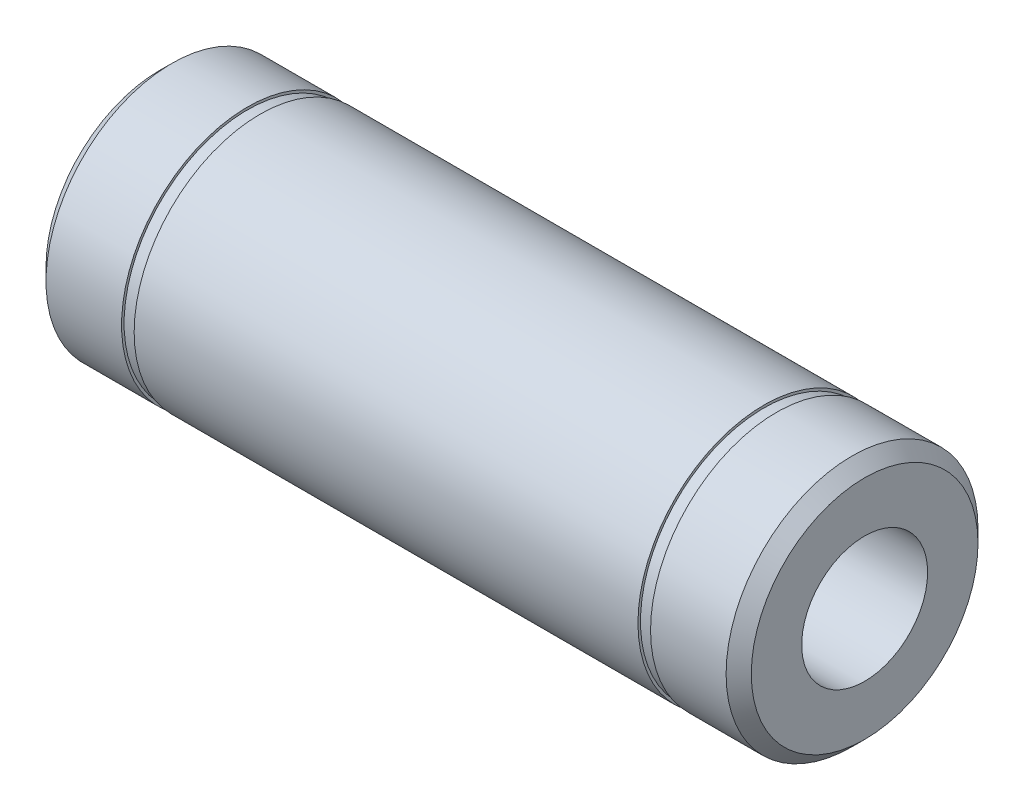
ISO-10303-21;
HEADER;
FILE_DESCRIPTION(('STEP AP214'),'2;1');
FILE_NAME('part.step','',(''),(''),'','','');
FILE_SCHEMA(('AUTOMOTIVE_DESIGN { 1 0 10303 214 1 1 1 1 }'));
ENDSEC;
DATA;
#1=APPLICATION_CONTEXT('core data for automotive mechanical design processes');
#2=APPLICATION_PROTOCOL_DEFINITION('international standard','automotive_design',2000,#1);
#3=PRODUCT_CONTEXT('',#1,'mechanical');
#4=PRODUCT('Part','Part','',(#3));
#5=PRODUCT_RELATED_PRODUCT_CATEGORY('part','',(#4));
#6=PRODUCT_DEFINITION_FORMATION('','',#4);
#7=PRODUCT_DEFINITION_CONTEXT('part definition',#1,'design');
#8=PRODUCT_DEFINITION('design','',#6,#7);
#9=PRODUCT_DEFINITION_SHAPE('','',#8);
#10=(LENGTH_UNIT() NAMED_UNIT(*) SI_UNIT(.MILLI.,.METRE.));
#11=(NAMED_UNIT(*) PLANE_ANGLE_UNIT() SI_UNIT($,.RADIAN.));
#12=(NAMED_UNIT(*) SI_UNIT($,.STERADIAN.) SOLID_ANGLE_UNIT());
#13=UNCERTAINTY_MEASURE_WITH_UNIT(LENGTH_MEASURE(1.E-05),#10,'distance_accuracy_value','');
#14=(GEOMETRIC_REPRESENTATION_CONTEXT(3) GLOBAL_UNCERTAINTY_ASSIGNED_CONTEXT((#13)) GLOBAL_UNIT_ASSIGNED_CONTEXT((#10,
#11,#12)) REPRESENTATION_CONTEXT('',''));
#15=CARTESIAN_POINT('',(0.,0.,0.));
#16=DIRECTION('',(0.,0.,1.));
#17=DIRECTION('',(1.,0.,0.));
#18=AXIS2_PLACEMENT_3D('',#15,#16,#17);
#19=CARTESIAN_POINT('',(14.,0.,0.));
#20=DIRECTION('',(-1.,0.,0.));
#21=DIRECTION('',(0.,0.,1.));
#22=AXIS2_PLACEMENT_3D('',#19,#20,#21);
#23=CYLINDRICAL_SURFACE('',#22,5.);
#24=CARTESIAN_POINT('',(13.5,0.,0.));
#25=DIRECTION('',(1.,0.,0.));
#26=DIRECTION('',(0.,0.,-1.));
#27=AXIS2_PLACEMENT_3D('',#24,#25,#26);
#28=CIRCLE('',#27,5.);
#29=CARTESIAN_POINT('',(13.5,0.,-5.));
#30=VERTEX_POINT('',#29);
#31=EDGE_CURVE('E48',#30,#30,#28,.F.);
#32=ORIENTED_EDGE('',*,*,#31,.T.);
#33=EDGE_LOOP('',(#32));
#34=FACE_BOUND('',#33,.T.);
#35=CARTESIAN_POINT('',(10.5,0.,0.));
#36=DIRECTION('',(-1.,0.,0.));
#37=DIRECTION('',(0.,0.,1.));
#38=AXIS2_PLACEMENT_3D('',#35,#36,#37);
#39=CIRCLE('',#38,5.);
#40=CARTESIAN_POINT('',(10.5,0.,5.));
#41=VERTEX_POINT('',#40);
#42=EDGE_CURVE('E44',#41,#41,#39,.T.);
#43=ORIENTED_EDGE('',*,*,#42,.F.);
#44=EDGE_LOOP('',(#43));
#45=FACE_BOUND('',#44,.T.);
#46=ADVANCED_FACE('F39',(#34,#45),#23,.T.);
#47=CARTESIAN_POINT('',(-13.5,0.,0.));
#48=DIRECTION('',(1.,0.,0.));
#49=DIRECTION('',(0.,0.,-1.));
#50=AXIS2_PLACEMENT_3D('',#47,#48,#49);
#51=CIRCLE('',#50,5.);
#52=CARTESIAN_POINT('',(-13.5,0.,-5.));
#53=VERTEX_POINT('',#52);
#54=EDGE_CURVE('E53',#53,#53,#51,.T.);
#55=ORIENTED_EDGE('',*,*,#54,.T.);
#56=EDGE_LOOP('',(#55));
#57=FACE_BOUND('',#56,.T.);
#58=CARTESIAN_POINT('',(-10.5,0.,0.));
#59=DIRECTION('',(1.,0.,0.));
#60=DIRECTION('',(0.,0.,-1.));
#61=AXIS2_PLACEMENT_3D('',#58,#59,#60);
#62=CIRCLE('',#61,5.);
#63=CARTESIAN_POINT('',(-10.5,0.,-5.));
#64=VERTEX_POINT('',#63);
#65=EDGE_CURVE('E60',#64,#64,#62,.T.);
#66=ORIENTED_EDGE('',*,*,#65,.F.);
#67=EDGE_LOOP('',(#66));
#68=FACE_BOUND('',#67,.T.);
#69=ADVANCED_FACE('F93',(#57,#68),#23,.T.);
#70=CARTESIAN_POINT('',(14.,0.,0.));
#71=DIRECTION('',(1.,0.,0.));
#72=DIRECTION('',(0.,0.,-1.));
#73=AXIS2_PLACEMENT_3D('',#70,#71,#72);
#74=PLANE('',#73);
#75=CARTESIAN_POINT('',(14.,0.,0.));
#76=DIRECTION('',(1.,0.,0.));
#77=DIRECTION('',(0.,0.,-1.));
#78=AXIS2_PLACEMENT_3D('',#75,#76,#77);
#79=CIRCLE('',#78,4.49999999999999);
#80=CARTESIAN_POINT('',(14.,0.,-4.49999999999999));
#81=VERTEX_POINT('',#80);
#82=EDGE_CURVE('E86',#81,#81,#79,.T.);
#83=ORIENTED_EDGE('',*,*,#82,.T.);
#84=EDGE_LOOP('',(#83));
#85=FACE_BOUND('',#84,.T.);
#86=CARTESIAN_POINT('',(14.,0.,0.));
#87=DIRECTION('',(1.,0.,0.));
#88=DIRECTION('',(0.,0.,-1.));
#89=AXIS2_PLACEMENT_3D('',#86,#87,#88);
#90=CIRCLE('',#89,2.5);
#91=CARTESIAN_POINT('',(14.,0.,-2.5));
#92=VERTEX_POINT('',#91);
#93=EDGE_CURVE('E83',#92,#92,#90,.T.);
#94=ORIENTED_EDGE('',*,*,#93,.F.);
#95=EDGE_LOOP('',(#94));
#96=FACE_BOUND('',#95,.T.);
#97=ADVANCED_FACE('F116',(#85,#96),#74,.T.);
#98=CARTESIAN_POINT('',(-14.,0.,0.));
#99=DIRECTION('',(1.,0.,0.));
#100=DIRECTION('',(0.,0.,-1.));
#101=AXIS2_PLACEMENT_3D('',#98,#99,#100);
#102=PLANE('',#101);
#103=CARTESIAN_POINT('',(-14.,0.,0.));
#104=DIRECTION('',(1.,0.,0.));
#105=DIRECTION('',(0.,0.,-1.));
#106=AXIS2_PLACEMENT_3D('',#103,#104,#105);
#107=CIRCLE('',#106,4.5);
#108=CARTESIAN_POINT('',(-14.,0.,-4.5));
#109=VERTEX_POINT('',#108);
#110=EDGE_CURVE('E11',#109,#109,#107,.F.);
#111=ORIENTED_EDGE('',*,*,#110,.T.);
#112=EDGE_LOOP('',(#111));
#113=FACE_BOUND('',#112,.T.);
#114=CARTESIAN_POINT('',(-14.,0.,0.));
#115=DIRECTION('',(1.,0.,0.));
#116=DIRECTION('',(0.,0.,-1.));
#117=AXIS2_PLACEMENT_3D('',#114,#115,#116);
#118=CIRCLE('',#117,2.5);
#119=CARTESIAN_POINT('',(-14.,0.,-2.5));
#120=VERTEX_POINT('',#119);
#121=EDGE_CURVE('E63',#120,#120,#118,.T.);
#122=ORIENTED_EDGE('',*,*,#121,.T.);
#123=EDGE_LOOP('',(#122));
#124=FACE_BOUND('',#123,.T.);
#125=ADVANCED_FACE('F120',(#113,#124),#102,.F.);
#126=CARTESIAN_POINT('',(10.,0.,0.));
#127=DIRECTION('',(-1.,0.,0.));
#128=DIRECTION('',(0.,0.,1.));
#129=AXIS2_PLACEMENT_3D('',#126,#127,#128);
#130=CIRCLE('',#129,5.);
#131=CARTESIAN_POINT('',(10.,0.,5.));
#132=VERTEX_POINT('',#131);
#133=EDGE_CURVE('E64',#132,#132,#130,.T.);
#134=ORIENTED_EDGE('',*,*,#133,.T.);
#135=EDGE_LOOP('',(#134));
#136=FACE_BOUND('',#135,.T.);
#137=CARTESIAN_POINT('',(-10.,0.,0.));
#138=DIRECTION('',(1.,0.,0.));
#139=DIRECTION('',(0.,0.,-1.));
#140=AXIS2_PLACEMENT_3D('',#137,#138,#139);
#141=CIRCLE('',#140,5.);
#142=CARTESIAN_POINT('',(-10.,0.,-5.));
#143=VERTEX_POINT('',#142);
#144=EDGE_CURVE('E57',#143,#143,#141,.T.);
#145=ORIENTED_EDGE('',*,*,#144,.T.);
#146=EDGE_LOOP('',(#145));
#147=FACE_BOUND('',#146,.T.);
#148=ADVANCED_FACE('F112',(#136,#147),#23,.T.);
#149=CARTESIAN_POINT('',(14.,0.,0.));
#150=DIRECTION('',(-1.,0.,0.));
#151=DIRECTION('',(0.,0.,1.));
#152=AXIS2_PLACEMENT_3D('',#149,#150,#151);
#153=CYLINDRICAL_SURFACE('',#152,2.5);
#154=ORIENTED_EDGE('',*,*,#93,.T.);
#155=EDGE_LOOP('',(#154));
#156=FACE_BOUND('',#155,.T.);
#157=ORIENTED_EDGE('',*,*,#121,.F.);
#158=EDGE_LOOP('',(#157));
#159=FACE_BOUND('',#158,.T.);
#160=ADVANCED_FACE('F107',(#156,#159),#153,.F.);
#161=CARTESIAN_POINT('',(14.,0.,0.));
#162=DIRECTION('',(-1.,0.,0.));
#163=DIRECTION('',(0.,0.,1.));
#164=AXIS2_PLACEMENT_3D('',#161,#162,#163);
#165=CONICAL_SURFACE('',#164,4.49999999999999,0.785398163397449);
#166=ORIENTED_EDGE('',*,*,#31,.F.);
#167=EDGE_LOOP('',(#166));
#168=FACE_BOUND('',#167,.T.);
#169=ORIENTED_EDGE('',*,*,#82,.F.);
#170=EDGE_LOOP('',(#169));
#171=FACE_BOUND('',#170,.T.);
#172=ADVANCED_FACE('F98',(#168,#171),#165,.T.);
#173=CARTESIAN_POINT('',(-13.5,0.,0.));
#174=DIRECTION('',(1.,0.,0.));
#175=DIRECTION('',(0.,0.,-1.));
#176=AXIS2_PLACEMENT_3D('',#173,#174,#175);
#177=CONICAL_SURFACE('',#176,5.,0.785398163397451);
#178=ORIENTED_EDGE('',*,*,#110,.F.);
#179=EDGE_LOOP('',(#178));
#180=FACE_BOUND('',#179,.T.);
#181=ORIENTED_EDGE('',*,*,#54,.F.);
#182=EDGE_LOOP('',(#181));
#183=FACE_BOUND('',#182,.T.);
#184=ADVANCED_FACE('F42',(#180,#183),#177,.T.);
#185=CARTESIAN_POINT('',(-10.5,0.,0.));
#186=DIRECTION('',(1.,0.,0.));
#187=DIRECTION('',(0.,0.,-1.));
#188=AXIS2_PLACEMENT_3D('',#185,#186,#187);
#189=PLANE('',#188);
#190=CARTESIAN_POINT('',(-10.5,0.,0.));
#191=DIRECTION('',(1.,0.,0.));
#192=DIRECTION('',(0.,0.,-1.));
#193=AXIS2_PLACEMENT_3D('',#190,#191,#192);
#194=CIRCLE('',#193,4.9);
#195=CARTESIAN_POINT('',(-10.5,0.,-4.9));
#196=VERTEX_POINT('',#195);
#197=EDGE_CURVE('E61',#196,#196,#194,.T.);
#198=ORIENTED_EDGE('',*,*,#197,.F.);
#199=EDGE_LOOP('',(#198));
#200=FACE_BOUND('',#199,.T.);
#201=ORIENTED_EDGE('',*,*,#65,.T.);
#202=EDGE_LOOP('',(#201));
#203=FACE_BOUND('',#202,.T.);
#204=ADVANCED_FACE('F97',(#200,#203),#189,.T.);
#205=CARTESIAN_POINT('',(-10.,0.,0.));
#206=DIRECTION('',(1.,0.,0.));
#207=DIRECTION('',(0.,0.,-1.));
#208=AXIS2_PLACEMENT_3D('',#205,#206,#207);
#209=PLANE('',#208);
#210=CARTESIAN_POINT('',(-10.,0.,0.));
#211=DIRECTION('',(1.,0.,0.));
#212=DIRECTION('',(0.,0.,-1.));
#213=AXIS2_PLACEMENT_3D('',#210,#211,#212);
#214=CIRCLE('',#213,4.9);
#215=CARTESIAN_POINT('',(-10.,0.,-4.9));
#216=VERTEX_POINT('',#215);
#217=EDGE_CURVE('E70',#216,#216,#214,.T.);
#218=ORIENTED_EDGE('',*,*,#217,.T.);
#219=EDGE_LOOP('',(#218));
#220=FACE_BOUND('',#219,.T.);
#221=ORIENTED_EDGE('',*,*,#144,.F.);
#222=EDGE_LOOP('',(#221));
#223=FACE_BOUND('',#222,.T.);
#224=ADVANCED_FACE('F104',(#220,#223),#209,.F.);
#225=CARTESIAN_POINT('',(-10.5,0.,0.));
#226=DIRECTION('',(1.,0.,0.));
#227=DIRECTION('',(0.,0.,-1.));
#228=AXIS2_PLACEMENT_3D('',#225,#226,#227);
#229=CYLINDRICAL_SURFACE('',#228,4.9);
#230=ORIENTED_EDGE('',*,*,#197,.T.);
#231=EDGE_LOOP('',(#230));
#232=FACE_BOUND('',#231,.T.);
#233=ORIENTED_EDGE('',*,*,#217,.F.);
#234=EDGE_LOOP('',(#233));
#235=FACE_BOUND('',#234,.T.);
#236=ADVANCED_FACE('F131',(#232,#235),#229,.T.);
#237=CARTESIAN_POINT('',(10.5,0.,0.));
#238=DIRECTION('',(-1.,0.,0.));
#239=DIRECTION('',(0.,0.,1.));
#240=AXIS2_PLACEMENT_3D('',#237,#238,#239);
#241=PLANE('',#240);
#242=CARTESIAN_POINT('',(10.5,0.,0.));
#243=DIRECTION('',(1.,0.,0.));
#244=DIRECTION('',(0.,0.,-1.));
#245=AXIS2_PLACEMENT_3D('',#242,#243,#244);
#246=CIRCLE('',#245,4.9);
#247=CARTESIAN_POINT('',(10.5,0.,-4.9));
#248=VERTEX_POINT('',#247);
#249=EDGE_CURVE('E66',#248,#248,#246,.T.);
#250=ORIENTED_EDGE('',*,*,#249,.T.);
#251=EDGE_LOOP('',(#250));
#252=FACE_BOUND('',#251,.T.);
#253=ORIENTED_EDGE('',*,*,#42,.T.);
#254=EDGE_LOOP('',(#253));
#255=FACE_BOUND('',#254,.T.);
#256=ADVANCED_FACE('F137',(#252,#255),#241,.T.);
#257=CARTESIAN_POINT('',(10.,0.,0.));
#258=DIRECTION('',(-1.,0.,0.));
#259=DIRECTION('',(0.,0.,1.));
#260=AXIS2_PLACEMENT_3D('',#257,#258,#259);
#261=PLANE('',#260);
#262=CARTESIAN_POINT('',(10.,0.,0.));
#263=DIRECTION('',(1.,0.,0.));
#264=DIRECTION('',(0.,0.,-1.));
#265=AXIS2_PLACEMENT_3D('',#262,#263,#264);
#266=CIRCLE('',#265,4.9);
#267=CARTESIAN_POINT('',(10.,0.,-4.9));
#268=VERTEX_POINT('',#267);
#269=EDGE_CURVE('E72',#268,#268,#266,.T.);
#270=ORIENTED_EDGE('',*,*,#269,.F.);
#271=EDGE_LOOP('',(#270));
#272=FACE_BOUND('',#271,.T.);
#273=ORIENTED_EDGE('',*,*,#133,.F.);
#274=EDGE_LOOP('',(#273));
#275=FACE_BOUND('',#274,.T.);
#276=ADVANCED_FACE('F209',(#272,#275),#261,.F.);
#277=CARTESIAN_POINT('',(10.5,0.,0.));
#278=DIRECTION('',(-1.,0.,0.));
#279=DIRECTION('',(0.,0.,1.));
#280=AXIS2_PLACEMENT_3D('',#277,#278,#279);
#281=CYLINDRICAL_SURFACE('',#280,4.9);
#282=ORIENTED_EDGE('',*,*,#249,.F.);
#283=EDGE_LOOP('',(#282));
#284=FACE_BOUND('',#283,.T.);
#285=ORIENTED_EDGE('',*,*,#269,.T.);
#286=EDGE_LOOP('',(#285));
#287=FACE_BOUND('',#286,.T.);
#288=ADVANCED_FACE('F218',(#284,#287),#281,.T.);
#289=CLOSED_SHELL('',(#46,#69,#97,#125,#148,#160,#172,#184,#204,#224,#236,#256,#276,#288));
#290=MANIFOLD_SOLID_BREP('B2',#289);
#291=ADVANCED_BREP_SHAPE_REPRESENTATION('',(#18,#290),#14);
#292=SHAPE_DEFINITION_REPRESENTATION(#9,#291);
ENDSEC;
END-ISO-10303-21;
